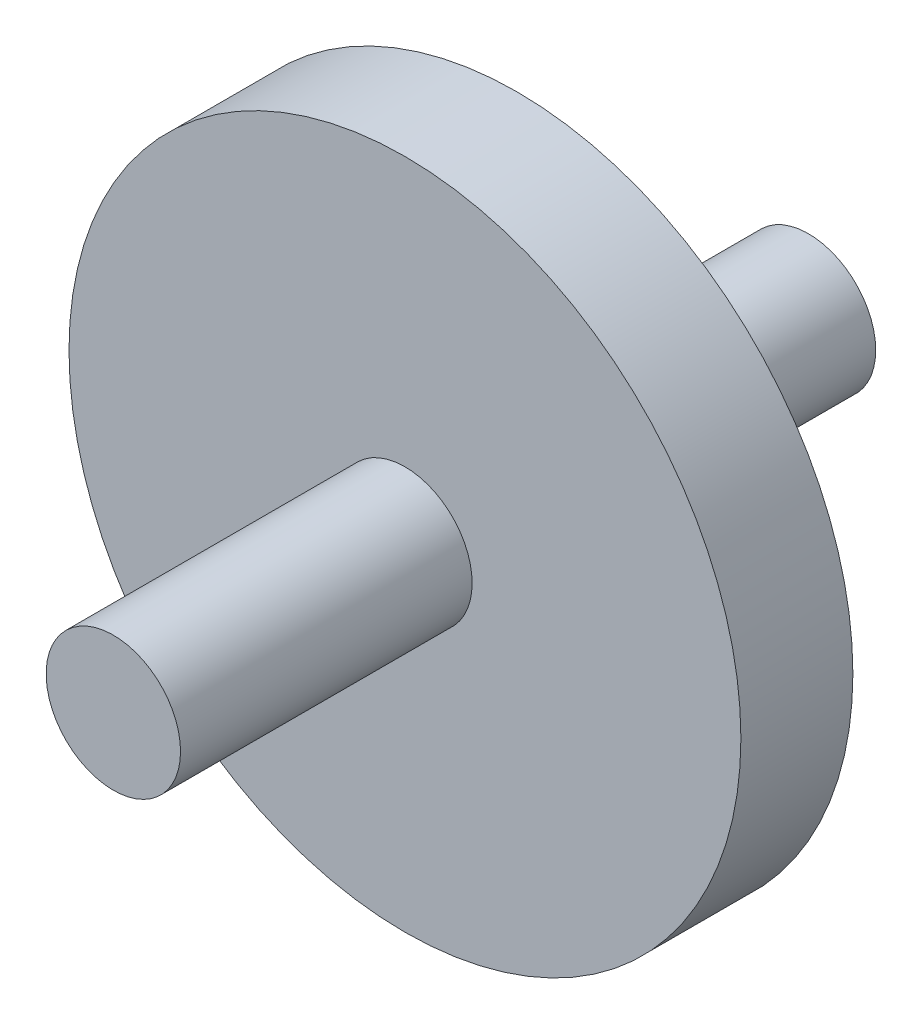
ISO-10303-21;
HEADER;
FILE_DESCRIPTION(('STEP AP214'),'2;1');
FILE_NAME('part.step','',(''),(''),'','','');
FILE_SCHEMA(('AUTOMOTIVE_DESIGN { 1 0 10303 214 1 1 1 1 }'));
ENDSEC;
DATA;
#1=APPLICATION_CONTEXT('core data for automotive mechanical design processes');
#2=APPLICATION_PROTOCOL_DEFINITION('international standard','automotive_design',2000,#1);
#3=PRODUCT_CONTEXT('',#1,'mechanical');
#4=PRODUCT('Part','Part','',(#3));
#5=PRODUCT_RELATED_PRODUCT_CATEGORY('part','',(#4));
#6=PRODUCT_DEFINITION_FORMATION('','',#4);
#7=PRODUCT_DEFINITION_CONTEXT('part definition',#1,'design');
#8=PRODUCT_DEFINITION('design','',#6,#7);
#9=PRODUCT_DEFINITION_SHAPE('','',#8);
#10=(LENGTH_UNIT() NAMED_UNIT(*) SI_UNIT(.MILLI.,.METRE.));
#11=(NAMED_UNIT(*) PLANE_ANGLE_UNIT() SI_UNIT($,.RADIAN.));
#12=(NAMED_UNIT(*) SI_UNIT($,.STERADIAN.) SOLID_ANGLE_UNIT());
#13=UNCERTAINTY_MEASURE_WITH_UNIT(LENGTH_MEASURE(1.E-05),#10,'distance_accuracy_value','');
#14=(GEOMETRIC_REPRESENTATION_CONTEXT(3) GLOBAL_UNCERTAINTY_ASSIGNED_CONTEXT((#13)) GLOBAL_UNIT_ASSIGNED_CONTEXT((#10,
#11,#12)) REPRESENTATION_CONTEXT('',''));
#15=CARTESIAN_POINT('',(0.,0.,0.));
#16=DIRECTION('',(0.,0.,1.));
#17=DIRECTION('',(1.,0.,0.));
#18=AXIS2_PLACEMENT_3D('',#15,#16,#17);
#19=CARTESIAN_POINT('',(35.,0.,16.25));
#20=DIRECTION('',(0.,0.,-1.));
#21=DIRECTION('',(-1.,0.,0.));
#22=AXIS2_PLACEMENT_3D('',#19,#20,#21);
#23=CYLINDRICAL_SURFACE('',#22,7.50000000000001);
#24=CARTESIAN_POINT('',(35.,0.,16.25));
#25=DIRECTION('',(0.,0.,1.));
#26=DIRECTION('',(1.,0.,0.));
#27=AXIS2_PLACEMENT_3D('',#24,#25,#26);
#28=CIRCLE('',#27,7.50000000000001);
#29=CARTESIAN_POINT('',(42.5,0.,16.25));
#30=VERTEX_POINT('',#29);
#31=EDGE_CURVE('E47',#30,#30,#28,.T.);
#32=ORIENTED_EDGE('',*,*,#31,.F.);
#33=EDGE_LOOP('',(#32));
#34=FACE_BOUND('',#33,.T.);
#35=CARTESIAN_POINT('',(35.,0.,13.75));
#36=DIRECTION('',(0.,0.,1.));
#37=DIRECTION('',(1.,0.,0.));
#38=AXIS2_PLACEMENT_3D('',#35,#36,#37);
#39=CIRCLE('',#38,7.50000000000001);
#40=CARTESIAN_POINT('',(42.5,0.,13.75));
#41=VERTEX_POINT('',#40);
#42=EDGE_CURVE('E51',#41,#41,#39,.T.);
#43=ORIENTED_EDGE('',*,*,#42,.T.);
#44=EDGE_LOOP('',(#43));
#45=FACE_BOUND('',#44,.T.);
#46=ADVANCED_FACE('F41',(#34,#45),#23,.T.);
#47=CARTESIAN_POINT('',(35.,0.,16.25));
#48=DIRECTION('',(0.,0.,1.));
#49=DIRECTION('',(1.,0.,0.));
#50=AXIS2_PLACEMENT_3D('',#47,#48,#49);
#51=PLANE('',#50);
#52=CARTESIAN_POINT('',(35.,0.,16.25));
#53=DIRECTION('',(0.,0.,1.));
#54=DIRECTION('',(1.,0.,0.));
#55=AXIS2_PLACEMENT_3D('',#52,#53,#54);
#56=CIRCLE('',#55,1.5);
#57=CARTESIAN_POINT('',(36.5,0.,16.25));
#58=VERTEX_POINT('',#57);
#59=EDGE_CURVE('E55',#58,#58,#56,.F.);
#60=ORIENTED_EDGE('',*,*,#59,.T.);
#61=EDGE_LOOP('',(#60));
#62=FACE_BOUND('',#61,.T.);
#63=ORIENTED_EDGE('',*,*,#31,.T.);
#64=EDGE_LOOP('',(#63));
#65=FACE_BOUND('',#64,.T.);
#66=ADVANCED_FACE('F80',(#62,#65),#51,.T.);
#67=CARTESIAN_POINT('',(35.,0.,13.75));
#68=DIRECTION('',(0.,0.,1.));
#69=DIRECTION('',(1.,0.,0.));
#70=AXIS2_PLACEMENT_3D('',#67,#68,#69);
#71=PLANE('',#70);
#72=CARTESIAN_POINT('',(35.,0.,13.75));
#73=DIRECTION('',(0.,0.,1.));
#74=DIRECTION('',(1.,0.,0.));
#75=AXIS2_PLACEMENT_3D('',#72,#73,#74);
#76=CIRCLE('',#75,1.5);
#77=CARTESIAN_POINT('',(36.5,0.,13.75));
#78=VERTEX_POINT('',#77);
#79=EDGE_CURVE('E10',#78,#78,#76,.F.);
#80=ORIENTED_EDGE('',*,*,#79,.F.);
#81=EDGE_LOOP('',(#80));
#82=FACE_BOUND('',#81,.T.);
#83=ORIENTED_EDGE('',*,*,#42,.F.);
#84=EDGE_LOOP('',(#83));
#85=FACE_BOUND('',#84,.T.);
#86=ADVANCED_FACE('F71',(#82,#85),#71,.F.);
#87=CARTESIAN_POINT('',(35.,0.,7.24027456274831));
#88=DIRECTION('',(0.,0.,1.));
#89=DIRECTION('',(1.,0.,0.));
#90=AXIS2_PLACEMENT_3D('',#87,#88,#89);
#91=PLANE('',#90);
#92=CARTESIAN_POINT('',(35.,0.,7.24027456274831));
#93=DIRECTION('',(0.,0.,1.));
#94=DIRECTION('',(1.,0.,0.));
#95=AXIS2_PLACEMENT_3D('',#92,#93,#94);
#96=CIRCLE('',#95,1.5);
#97=CARTESIAN_POINT('',(36.5,0.,7.24027456274831));
#98=VERTEX_POINT('',#97);
#99=EDGE_CURVE('E63',#98,#98,#96,.T.);
#100=ORIENTED_EDGE('',*,*,#99,.F.);
#101=EDGE_LOOP('',(#100));
#102=FACE_BOUND('',#101,.T.);
#103=ADVANCED_FACE('F69',(#102),#91,.F.);
#104=CARTESIAN_POINT('',(35.,0.,22.7597254372517));
#105=DIRECTION('',(0.,0.,-1.));
#106=DIRECTION('',(-1.,0.,0.));
#107=AXIS2_PLACEMENT_3D('',#104,#105,#106);
#108=CYLINDRICAL_SURFACE('',#107,1.5);
#109=ORIENTED_EDGE('',*,*,#99,.T.);
#110=EDGE_LOOP('',(#109));
#111=FACE_BOUND('',#110,.T.);
#112=ORIENTED_EDGE('',*,*,#79,.T.);
#113=EDGE_LOOP('',(#112));
#114=FACE_BOUND('',#113,.T.);
#115=ADVANCED_FACE('F67',(#111,#114),#108,.T.);
#116=ORIENTED_EDGE('',*,*,#59,.F.);
#117=EDGE_LOOP('',(#116));
#118=FACE_BOUND('',#117,.T.);
#119=CARTESIAN_POINT('',(35.,0.,22.7597254372517));
#120=DIRECTION('',(0.,0.,1.));
#121=DIRECTION('',(1.,0.,0.));
#122=AXIS2_PLACEMENT_3D('',#119,#120,#121);
#123=CIRCLE('',#122,1.5);
#124=CARTESIAN_POINT('',(36.5,0.,22.7597254372517));
#125=VERTEX_POINT('',#124);
#126=EDGE_CURVE('E60',#125,#125,#123,.T.);
#127=ORIENTED_EDGE('',*,*,#126,.F.);
#128=EDGE_LOOP('',(#127));
#129=FACE_BOUND('',#128,.T.);
#130=ADVANCED_FACE('F78',(#118,#129),#108,.T.);
#131=CARTESIAN_POINT('',(35.,0.,22.7597254372517));
#132=DIRECTION('',(0.,0.,1.));
#133=DIRECTION('',(1.,0.,0.));
#134=AXIS2_PLACEMENT_3D('',#131,#132,#133);
#135=PLANE('',#134);
#136=ORIENTED_EDGE('',*,*,#126,.T.);
#137=EDGE_LOOP('',(#136));
#138=FACE_BOUND('',#137,.T.);
#139=ADVANCED_FACE('F98',(#138),#135,.T.);
#140=CLOSED_SHELL('',(#46,#66,#86,#103,#115,#130,#139));
#141=MANIFOLD_SOLID_BREP('B2',#140);
#142=ADVANCED_BREP_SHAPE_REPRESENTATION('',(#18,#141),#14);
#143=SHAPE_DEFINITION_REPRESENTATION(#9,#142);
ENDSEC;
END-ISO-10303-21;
